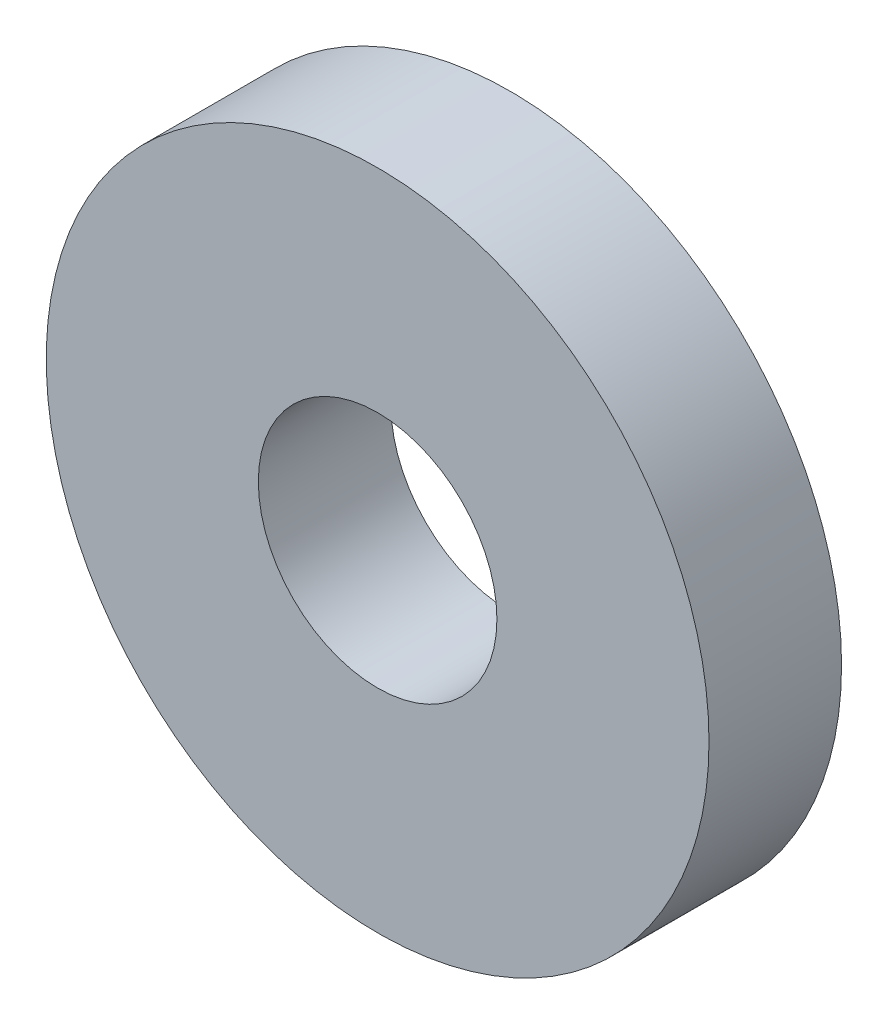
ISO-10303-21;
HEADER;
FILE_DESCRIPTION(('STEP AP214'),'2;1');
FILE_NAME('part.step','',(''),(''),'','','');
FILE_SCHEMA(('AUTOMOTIVE_DESIGN { 1 0 10303 214 1 1 1 1 }'));
ENDSEC;
DATA;
#1=APPLICATION_CONTEXT('core data for automotive mechanical design processes');
#2=APPLICATION_PROTOCOL_DEFINITION('international standard','automotive_design',2000,#1);
#3=PRODUCT_CONTEXT('',#1,'mechanical');
#4=PRODUCT('Part','Part','',(#3));
#5=PRODUCT_RELATED_PRODUCT_CATEGORY('part','',(#4));
#6=PRODUCT_DEFINITION_FORMATION('','',#4);
#7=PRODUCT_DEFINITION_CONTEXT('part definition',#1,'design');
#8=PRODUCT_DEFINITION('design','',#6,#7);
#9=PRODUCT_DEFINITION_SHAPE('','',#8);
#10=(LENGTH_UNIT() NAMED_UNIT(*) SI_UNIT(.MILLI.,.METRE.));
#11=(NAMED_UNIT(*) PLANE_ANGLE_UNIT() SI_UNIT($,.RADIAN.));
#12=(NAMED_UNIT(*) SI_UNIT($,.STERADIAN.) SOLID_ANGLE_UNIT());
#13=UNCERTAINTY_MEASURE_WITH_UNIT(LENGTH_MEASURE(1.E-05),#10,'distance_accuracy_value','');
#14=(GEOMETRIC_REPRESENTATION_CONTEXT(3) GLOBAL_UNCERTAINTY_ASSIGNED_CONTEXT((#13)) GLOBAL_UNIT_ASSIGNED_CONTEXT((#10,
#11,#12)) REPRESENTATION_CONTEXT('',''));
#15=CARTESIAN_POINT('',(0.,0.,0.));
#16=DIRECTION('',(0.,0.,1.));
#17=DIRECTION('',(1.,0.,0.));
#18=AXIS2_PLACEMENT_3D('',#15,#16,#17);
#19=CARTESIAN_POINT('',(0.,0.,2.));
#20=DIRECTION('',(0.,0.,1.));
#21=DIRECTION('',(1.,0.,0.));
#22=AXIS2_PLACEMENT_3D('',#19,#20,#21);
#23=PLANE('',#22);
#24=CARTESIAN_POINT('',(0.,0.,2.));
#25=DIRECTION('',(0.,0.,1.));
#26=DIRECTION('',(1.,0.,0.));
#27=AXIS2_PLACEMENT_3D('',#24,#25,#26);
#28=CIRCLE('',#27,5.);
#29=CARTESIAN_POINT('',(5.,0.,2.));
#30=VERTEX_POINT('',#29);
#31=EDGE_CURVE('E10',#30,#30,#28,.T.);
#32=ORIENTED_EDGE('',*,*,#31,.T.);
#33=EDGE_LOOP('',(#32));
#34=FACE_BOUND('',#33,.T.);
#35=CARTESIAN_POINT('',(0.,0.,2.));
#36=DIRECTION('',(0.,0.,1.));
#37=DIRECTION('',(1.,0.,0.));
#38=AXIS2_PLACEMENT_3D('',#35,#36,#37);
#39=CIRCLE('',#38,1.8);
#40=CARTESIAN_POINT('',(1.8,0.,2.));
#41=VERTEX_POINT('',#40);
#42=EDGE_CURVE('E44',#41,#41,#39,.T.);
#43=ORIENTED_EDGE('',*,*,#42,.F.);
#44=EDGE_LOOP('',(#43));
#45=FACE_BOUND('',#44,.T.);
#46=ADVANCED_FACE('F33',(#34,#45),#23,.T.);
#47=CARTESIAN_POINT('',(0.,0.,0.));
#48=DIRECTION('',(0.,0.,1.));
#49=DIRECTION('',(1.,0.,0.));
#50=AXIS2_PLACEMENT_3D('',#47,#48,#49);
#51=PLANE('',#50);
#52=CARTESIAN_POINT('',(0.,0.,0.));
#53=DIRECTION('',(0.,0.,1.));
#54=DIRECTION('',(1.,0.,0.));
#55=AXIS2_PLACEMENT_3D('',#52,#53,#54);
#56=CIRCLE('',#55,5.);
#57=CARTESIAN_POINT('',(5.,0.,0.));
#58=VERTEX_POINT('',#57);
#59=EDGE_CURVE('E37',#58,#58,#56,.T.);
#60=ORIENTED_EDGE('',*,*,#59,.F.);
#61=EDGE_LOOP('',(#60));
#62=FACE_BOUND('',#61,.T.);
#63=CARTESIAN_POINT('',(0.,0.,0.));
#64=DIRECTION('',(0.,0.,1.));
#65=DIRECTION('',(1.,0.,0.));
#66=AXIS2_PLACEMENT_3D('',#63,#64,#65);
#67=CIRCLE('',#66,1.8);
#68=CARTESIAN_POINT('',(1.8,0.,0.));
#69=VERTEX_POINT('',#68);
#70=EDGE_CURVE('E46',#69,#69,#67,.T.);
#71=ORIENTED_EDGE('',*,*,#70,.T.);
#72=EDGE_LOOP('',(#71));
#73=FACE_BOUND('',#72,.T.);
#74=ADVANCED_FACE('F56',(#62,#73),#51,.F.);
#75=CARTESIAN_POINT('',(0.,0.,2.));
#76=DIRECTION('',(0.,0.,-1.));
#77=DIRECTION('',(-1.,0.,0.));
#78=AXIS2_PLACEMENT_3D('',#75,#76,#77);
#79=CYLINDRICAL_SURFACE('',#78,5.);
#80=ORIENTED_EDGE('',*,*,#31,.F.);
#81=EDGE_LOOP('',(#80));
#82=FACE_BOUND('',#81,.T.);
#83=ORIENTED_EDGE('',*,*,#59,.T.);
#84=EDGE_LOOP('',(#83));
#85=FACE_BOUND('',#84,.T.);
#86=ADVANCED_FACE('F35',(#82,#85),#79,.T.);
#87=CARTESIAN_POINT('',(0.,0.,2.));
#88=DIRECTION('',(0.,0.,-1.));
#89=DIRECTION('',(-1.,0.,0.));
#90=AXIS2_PLACEMENT_3D('',#87,#88,#89);
#91=CYLINDRICAL_SURFACE('',#90,1.8);
#92=ORIENTED_EDGE('',*,*,#42,.T.);
#93=EDGE_LOOP('',(#92));
#94=FACE_BOUND('',#93,.T.);
#95=ORIENTED_EDGE('',*,*,#70,.F.);
#96=EDGE_LOOP('',(#95));
#97=FACE_BOUND('',#96,.T.);
#98=ADVANCED_FACE('F52',(#94,#97),#91,.F.);
#99=CLOSED_SHELL('',(#46,#74,#86,#98));
#100=MANIFOLD_SOLID_BREP('B2',#99);
#101=ADVANCED_BREP_SHAPE_REPRESENTATION('',(#18,#100),#14);
#102=SHAPE_DEFINITION_REPRESENTATION(#9,#101);
ENDSEC;
END-ISO-10303-21;
